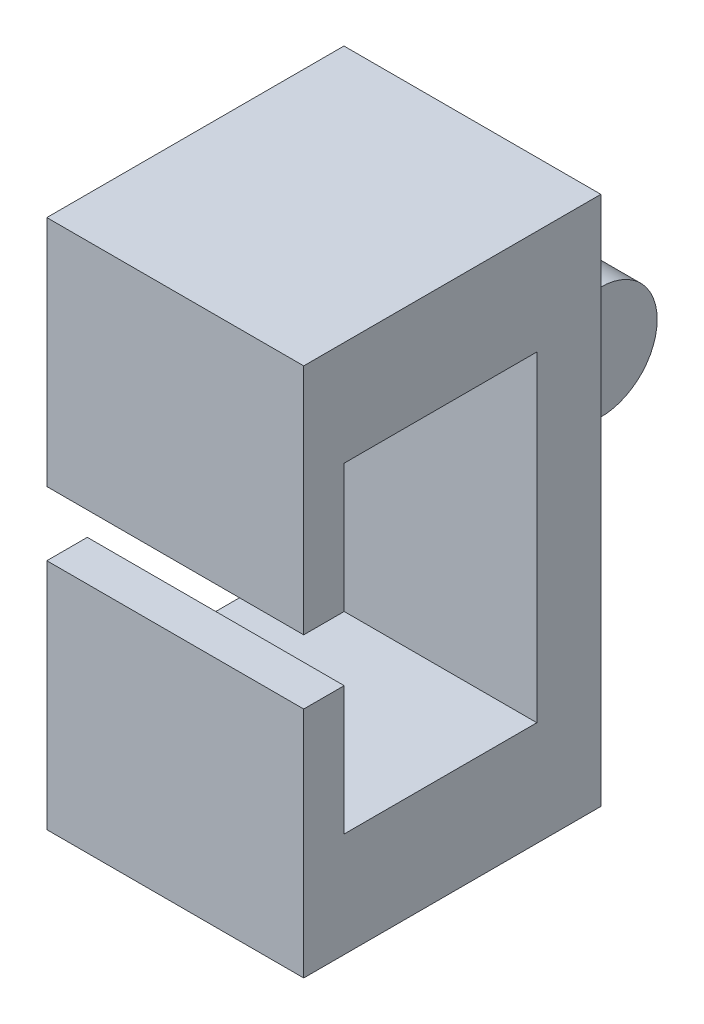
ISO-10303-21;
HEADER;
FILE_DESCRIPTION(('STEP AP214'),'2;1');
FILE_NAME('part.step','',(''),(''),'','','');
FILE_SCHEMA(('AUTOMOTIVE_DESIGN { 1 0 10303 214 1 1 1 1 }'));
ENDSEC;
DATA;
#1=APPLICATION_CONTEXT('core data for automotive mechanical design processes');
#2=APPLICATION_PROTOCOL_DEFINITION('international standard','automotive_design',2000,#1);
#3=PRODUCT_CONTEXT('',#1,'mechanical');
#4=PRODUCT('Part','Part','',(#3));
#5=PRODUCT_RELATED_PRODUCT_CATEGORY('part','',(#4));
#6=PRODUCT_DEFINITION_FORMATION('','',#4);
#7=PRODUCT_DEFINITION_CONTEXT('part definition',#1,'design');
#8=PRODUCT_DEFINITION('design','',#6,#7);
#9=PRODUCT_DEFINITION_SHAPE('','',#8);
#10=(LENGTH_UNIT() NAMED_UNIT(*) SI_UNIT(.MILLI.,.METRE.));
#11=(NAMED_UNIT(*) PLANE_ANGLE_UNIT() SI_UNIT($,.RADIAN.));
#12=(NAMED_UNIT(*) SI_UNIT($,.STERADIAN.) SOLID_ANGLE_UNIT());
#13=UNCERTAINTY_MEASURE_WITH_UNIT(LENGTH_MEASURE(1.E-05),#10,'distance_accuracy_value','');
#14=(GEOMETRIC_REPRESENTATION_CONTEXT(3) GLOBAL_UNCERTAINTY_ASSIGNED_CONTEXT((#13)) GLOBAL_UNIT_ASSIGNED_CONTEXT((#10,
#11,#12)) REPRESENTATION_CONTEXT('',''));
#15=CARTESIAN_POINT('',(0.,0.,0.));
#16=DIRECTION('',(0.,0.,1.));
#17=DIRECTION('',(1.,0.,0.));
#18=AXIS2_PLACEMENT_3D('',#15,#16,#17);
#19=CARTESIAN_POINT('',(25.4,0.,0.));
#20=DIRECTION('',(-1.,0.,0.));
#21=DIRECTION('',(0.,0.,1.));
#22=AXIS2_PLACEMENT_3D('',#19,#20,#21);
#23=CYLINDRICAL_SURFACE('',#22,11.1361216276526);
#24=CARTESIAN_POINT('',(25.4,0.,0.));
#25=DIRECTION('',(1.,0.,0.));
#26=DIRECTION('',(0.,0.,-1.));
#27=AXIS2_PLACEMENT_3D('',#24,#25,#26);
#28=CIRCLE('',#27,11.1361216276526);
#29=CARTESIAN_POINT('',(25.4,0.,-11.1361216276526));
#30=VERTEX_POINT('',#29);
#31=EDGE_CURVE('E52',#30,#30,#28,.T.);
#32=ORIENTED_EDGE('',*,*,#31,.F.);
#33=EDGE_LOOP('',(#32));
#34=FACE_BOUND('',#33,.T.);
#35=DIRECTION('',(-1.,0.,0.));
#36=VECTOR('',#35,1.);
#37=CARTESIAN_POINT('',(3.83463556575211,11.1361216276526,0.));
#38=LINE('',#37,#36);
#39=CARTESIAN_POINT('',(3.83463556575211,11.1361216276526,0.));
#40=VERTEX_POINT('',#39);
#41=CARTESIAN_POINT('',(0.,11.1361216276526,0.));
#42=VERTEX_POINT('',#41);
#43=EDGE_CURVE('E315',#40,#42,#38,.T.);
#44=ORIENTED_EDGE('',*,*,#43,.F.);
#45=CARTESIAN_POINT('',(3.83463556575211,0.,0.));
#46=DIRECTION('',(-1.,0.,0.));
#47=DIRECTION('',(0.,0.,1.));
#48=AXIS2_PLACEMENT_3D('',#45,#46,#47);
#49=CIRCLE('',#48,11.1361216276526);
#50=CARTESIAN_POINT('',(3.83463556575211,-11.1252,0.493082007248803));
#51=VERTEX_POINT('',#50);
#52=EDGE_CURVE('E11',#51,#40,#49,.T.);
#53=ORIENTED_EDGE('',*,*,#52,.F.);
#54=DIRECTION('',(-1.,0.,0.));
#55=VECTOR('',#54,1.);
#56=CARTESIAN_POINT('',(25.4,-11.1252,0.493082007248858));
#57=LINE('',#56,#55);
#58=CARTESIAN_POINT('',(0.,-11.1252,0.493082007248803));
#59=VERTEX_POINT('',#58);
#60=EDGE_CURVE('E65',#51,#59,#57,.T.);
#61=ORIENTED_EDGE('',*,*,#60,.T.);
#62=CARTESIAN_POINT('',(0.,0.,0.));
#63=DIRECTION('',(1.,0.,0.));
#64=DIRECTION('',(0.,0.,-1.));
#65=AXIS2_PLACEMENT_3D('',#62,#63,#64);
#66=CIRCLE('',#65,11.1361216276526);
#67=EDGE_CURVE('E323',#59,#42,#66,.T.);
#68=ORIENTED_EDGE('',*,*,#67,.T.);
#69=EDGE_LOOP('',(#44,#53,#61,#68));
#70=FACE_BOUND('',#69,.T.);
#71=ADVANCED_FACE('F44',(#34,#70),#23,.T.);
#72=CARTESIAN_POINT('',(25.4,0.,0.));
#73=DIRECTION('',(1.,0.,0.));
#74=DIRECTION('',(0.,0.,-1.));
#75=AXIS2_PLACEMENT_3D('',#72,#73,#74);
#76=PLANE('',#75);
#77=ORIENTED_EDGE('',*,*,#31,.T.);
#78=EDGE_LOOP('',(#77));
#79=FACE_BOUND('',#78,.T.);
#80=ADVANCED_FACE('F387',(#79),#76,.T.);
#81=CARTESIAN_POINT('',(0.,0.,0.));
#82=DIRECTION('',(1.,0.,0.));
#83=DIRECTION('',(0.,0.,-1.));
#84=AXIS2_PLACEMENT_3D('',#81,#82,#83);
#85=PLANE('',#84);
#86=ORIENTED_EDGE('',*,*,#67,.F.);
#87=DIRECTION('',(0.,0.,1.));
#88=VECTOR('',#87,1.);
#89=CARTESIAN_POINT('',(0.,-11.1252,0.));
#90=LINE('',#89,#88);
#91=CARTESIAN_POINT('',(0.,-11.1252,25.4));
#92=VERTEX_POINT('',#91);
#93=EDGE_CURVE('E294',#59,#92,#90,.T.);
#94=ORIENTED_EDGE('',*,*,#93,.T.);
#95=DIRECTION('',(0.,1.,0.));
#96=VECTOR('',#95,1.);
#97=CARTESIAN_POINT('',(0.,-31.75,25.4));
#98=LINE('',#97,#96);
#99=CARTESIAN_POINT('',(0.,-52.4146964792465,25.4));
#100=VERTEX_POINT('',#99);
#101=EDGE_CURVE('E285',#100,#92,#98,.T.);
#102=ORIENTED_EDGE('',*,*,#101,.F.);
#103=DIRECTION('',(0.,0.,-1.));
#104=VECTOR('',#103,1.);
#105=CARTESIAN_POINT('',(0.,-52.4146964792465,25.4));
#106=LINE('',#105,#104);
#107=CARTESIAN_POINT('',(0.,-52.4146964792465,84.1578930477657));
#108=VERTEX_POINT('',#107);
#109=EDGE_CURVE('E236',#108,#100,#106,.T.);
#110=ORIENTED_EDGE('',*,*,#109,.F.);
#111=DIRECTION('',(0.,-1.,0.));
#112=VECTOR('',#111,1.);
#113=CARTESIAN_POINT('',(0.,-52.4146964792465,84.1578930477657));
#114=LINE('',#113,#112);
#115=CARTESIAN_POINT('',(0.,-6.35,84.1578930477657));
#116=VERTEX_POINT('',#115);
#117=EDGE_CURVE('E168',#116,#108,#114,.T.);
#118=ORIENTED_EDGE('',*,*,#117,.F.);
#119=DIRECTION('',(0.,0.,1.));
#120=VECTOR('',#119,1.);
#121=CARTESIAN_POINT('',(0.,-6.35,76.1544905159104));
#122=LINE('',#121,#120);
#123=CARTESIAN_POINT('',(0.,-6.35,76.1544905159104));
#124=VERTEX_POINT('',#123);
#125=EDGE_CURVE('E192',#124,#116,#122,.T.);
#126=ORIENTED_EDGE('',*,*,#125,.F.);
#127=DIRECTION('',(0.,1.,0.));
#128=VECTOR('',#127,1.);
#129=CARTESIAN_POINT('',(0.,-52.4146964792465,76.1544905159105));
#130=LINE('',#129,#128);
#131=CARTESIAN_POINT('',(0.,-31.75,76.1544905159105));
#132=VERTEX_POINT('',#131);
#133=EDGE_CURVE('E175',#132,#124,#130,.T.);
#134=ORIENTED_EDGE('',*,*,#133,.F.);
#135=DIRECTION('',(0.,0.,1.));
#136=VECTOR('',#135,1.);
#137=CARTESIAN_POINT('',(0.,-31.75,25.4));
#138=LINE('',#137,#136);
#139=CARTESIAN_POINT('',(0.,-31.75,38.0544905159105));
#140=VERTEX_POINT('',#139);
#141=EDGE_CURVE('E241',#140,#132,#138,.T.);
#142=ORIENTED_EDGE('',*,*,#141,.F.);
#143=DIRECTION('',(0.,-1.,0.));
#144=VECTOR('',#143,1.);
#145=CARTESIAN_POINT('',(0.,-31.75,38.0544905159105));
#146=LINE('',#145,#144);
#147=CARTESIAN_POINT('',(0.,31.75,38.0544905159105));
#148=VERTEX_POINT('',#147);
#149=EDGE_CURVE('E279',#148,#140,#146,.T.);
#150=ORIENTED_EDGE('',*,*,#149,.F.);
#151=DIRECTION('',(0.,0.,-1.));
#152=VECTOR('',#151,1.);
#153=CARTESIAN_POINT('',(0.,31.75,25.4));
#154=LINE('',#153,#152);
#155=CARTESIAN_POINT('',(0.,31.75,76.1544905159105));
#156=VERTEX_POINT('',#155);
#157=EDGE_CURVE('E242',#156,#148,#154,.T.);
#158=ORIENTED_EDGE('',*,*,#157,.F.);
#159=DIRECTION('',(0.,1.,0.));
#160=VECTOR('',#159,1.);
#161=CARTESIAN_POINT('',(0.,52.4146964792465,76.1544905159105));
#162=LINE('',#161,#160);
#163=CARTESIAN_POINT('',(0.,6.35,76.1544905159105));
#164=VERTEX_POINT('',#163);
#165=EDGE_CURVE('E216',#164,#156,#162,.T.);
#166=ORIENTED_EDGE('',*,*,#165,.F.);
#167=DIRECTION('',(0.,0.,-1.));
#168=VECTOR('',#167,1.);
#169=CARTESIAN_POINT('',(0.,6.35,76.1544905159105));
#170=LINE('',#169,#168);
#171=CARTESIAN_POINT('',(0.,6.35,84.1578930477657));
#172=VERTEX_POINT('',#171);
#173=EDGE_CURVE('E218',#172,#164,#170,.T.);
#174=ORIENTED_EDGE('',*,*,#173,.F.);
#175=DIRECTION('',(0.,-1.,0.));
#176=VECTOR('',#175,1.);
#177=CARTESIAN_POINT('',(0.,52.4146964792465,84.1578930477657));
#178=LINE('',#177,#176);
#179=CARTESIAN_POINT('',(0.,52.4146964792465,84.1578930477657));
#180=VERTEX_POINT('',#179);
#181=EDGE_CURVE('E195',#180,#172,#178,.T.);
#182=ORIENTED_EDGE('',*,*,#181,.F.);
#183=DIRECTION('',(0.,0.,1.));
#184=VECTOR('',#183,1.);
#185=CARTESIAN_POINT('',(0.,52.4146964792465,25.4));
#186=LINE('',#185,#184);
#187=CARTESIAN_POINT('',(0.,52.4146964792465,25.4));
#188=VERTEX_POINT('',#187);
#189=EDGE_CURVE('E262',#188,#180,#186,.T.);
#190=ORIENTED_EDGE('',*,*,#189,.F.);
#191=CARTESIAN_POINT('',(0.,11.1361216276526,25.4));
#192=VERTEX_POINT('',#191);
#193=EDGE_CURVE('E251',#192,#188,#98,.T.);
#194=ORIENTED_EDGE('',*,*,#193,.F.);
#195=DIRECTION('',(0.,0.,1.));
#196=VECTOR('',#195,1.);
#197=CARTESIAN_POINT('',(0.,11.1361216276526,0.));
#198=LINE('',#197,#196);
#199=EDGE_CURVE('E297',#42,#192,#198,.T.);
#200=ORIENTED_EDGE('',*,*,#199,.F.);
#201=EDGE_LOOP('',(#86,#94,#102,#110,#118,#126,#134,#142,#150,#158,#166,#174,#182,#190,#194,#200));
#202=FACE_BOUND('',#201,.T.);
#203=ADVANCED_FACE('F340',(#202),#85,.F.);
#204=CARTESIAN_POINT('',(3.83463556575211,-11.1252,0.));
#205=DIRECTION('',(0.,-1.,0.));
#206=DIRECTION('',(0.,0.,-1.));
#207=AXIS2_PLACEMENT_3D('',#204,#205,#206);
#208=PLANE('',#207);
#209=ORIENTED_EDGE('',*,*,#60,.F.);
#210=DIRECTION('',(0.,0.,1.));
#211=VECTOR('',#210,1.);
#212=CARTESIAN_POINT('',(3.83463556575211,-11.1252,0.));
#213=LINE('',#212,#211);
#214=CARTESIAN_POINT('',(3.83463556575211,-11.1252,25.4));
#215=VERTEX_POINT('',#214);
#216=EDGE_CURVE('E298',#51,#215,#213,.T.);
#217=ORIENTED_EDGE('',*,*,#216,.T.);
#218=DIRECTION('',(-1.,0.,0.));
#219=VECTOR('',#218,1.);
#220=CARTESIAN_POINT('',(3.83463556575211,-11.1252,25.4));
#221=LINE('',#220,#219);
#222=EDGE_CURVE('E310',#215,#92,#221,.T.);
#223=ORIENTED_EDGE('',*,*,#222,.T.);
#224=ORIENTED_EDGE('',*,*,#93,.F.);
#225=EDGE_LOOP('',(#209,#217,#223,#224));
#226=FACE_BOUND('',#225,.T.);
#227=ADVANCED_FACE('F396',(#226),#208,.T.);
#228=CARTESIAN_POINT('',(3.83463556575211,11.1361216276526,0.));
#229=DIRECTION('',(0.,-1.,0.));
#230=DIRECTION('',(0.,0.,-1.));
#231=AXIS2_PLACEMENT_3D('',#228,#229,#230);
#232=PLANE('',#231);
#233=ORIENTED_EDGE('',*,*,#199,.T.);
#234=DIRECTION('',(-1.,0.,0.));
#235=VECTOR('',#234,1.);
#236=CARTESIAN_POINT('',(3.83463556575211,11.1361216276526,25.4));
#237=LINE('',#236,#235);
#238=CARTESIAN_POINT('',(3.83463556575211,11.1361216276526,25.4));
#239=VERTEX_POINT('',#238);
#240=EDGE_CURVE('E317',#239,#192,#237,.T.);
#241=ORIENTED_EDGE('',*,*,#240,.F.);
#242=DIRECTION('',(0.,0.,1.));
#243=VECTOR('',#242,1.);
#244=CARTESIAN_POINT('',(3.83463556575211,11.1361216276526,0.));
#245=LINE('',#244,#243);
#246=EDGE_CURVE('E302',#40,#239,#245,.T.);
#247=ORIENTED_EDGE('',*,*,#246,.F.);
#248=ORIENTED_EDGE('',*,*,#43,.T.);
#249=EDGE_LOOP('',(#233,#241,#247,#248));
#250=FACE_BOUND('',#249,.T.);
#251=ADVANCED_FACE('F334',(#250),#232,.F.);
#252=CARTESIAN_POINT('',(3.83463556575211,0.,0.));
#253=DIRECTION('',(-1.,0.,0.));
#254=DIRECTION('',(0.,0.,1.));
#255=AXIS2_PLACEMENT_3D('',#252,#253,#254);
#256=PLANE('',#255);
#257=ORIENTED_EDGE('',*,*,#216,.F.);
#258=ORIENTED_EDGE('',*,*,#52,.T.);
#259=ORIENTED_EDGE('',*,*,#246,.T.);
#260=DIRECTION('',(0.,-1.,0.));
#261=VECTOR('',#260,1.);
#262=CARTESIAN_POINT('',(3.83463556575211,11.1361216276526,25.4));
#263=LINE('',#262,#261);
#264=EDGE_CURVE('E299',#239,#215,#263,.T.);
#265=ORIENTED_EDGE('',*,*,#264,.T.);
#266=EDGE_LOOP('',(#257,#258,#259,#265));
#267=FACE_BOUND('',#266,.T.);
#268=ADVANCED_FACE('F404',(#267),#256,.F.);
#269=CARTESIAN_POINT('',(50.8,-31.75,25.4));
#270=DIRECTION('',(0.,0.,1.));
#271=DIRECTION('',(1.,0.,0.));
#272=AXIS2_PLACEMENT_3D('',#269,#270,#271);
#273=PLANE('',#272);
#274=ORIENTED_EDGE('',*,*,#222,.F.);
#275=ORIENTED_EDGE('',*,*,#264,.F.);
#276=ORIENTED_EDGE('',*,*,#240,.T.);
#277=ORIENTED_EDGE('',*,*,#193,.T.);
#278=DIRECTION('',(-1.,0.,0.));
#279=VECTOR('',#278,1.);
#280=CARTESIAN_POINT('',(50.8,52.4146964792465,25.4));
#281=LINE('',#280,#279);
#282=CARTESIAN_POINT('',(50.8,52.4146964792465,25.4));
#283=VERTEX_POINT('',#282);
#284=EDGE_CURVE('E176',#283,#188,#281,.T.);
#285=ORIENTED_EDGE('',*,*,#284,.F.);
#286=DIRECTION('',(0.,1.,0.));
#287=VECTOR('',#286,1.);
#288=CARTESIAN_POINT('',(50.8,-31.75,25.4));
#289=LINE('',#288,#287);
#290=CARTESIAN_POINT('',(50.8,-52.4146964792465,25.4));
#291=VERTEX_POINT('',#290);
#292=EDGE_CURVE('E274',#291,#283,#289,.T.);
#293=ORIENTED_EDGE('',*,*,#292,.F.);
#294=DIRECTION('',(-1.,0.,0.));
#295=VECTOR('',#294,1.);
#296=CARTESIAN_POINT('',(50.8,-52.4146964792465,25.4));
#297=LINE('',#296,#295);
#298=EDGE_CURVE('E239',#291,#100,#297,.T.);
#299=ORIENTED_EDGE('',*,*,#298,.T.);
#300=ORIENTED_EDGE('',*,*,#101,.T.);
#301=EDGE_LOOP('',(#274,#275,#276,#277,#285,#293,#299,#300));
#302=FACE_BOUND('',#301,.T.);
#303=ADVANCED_FACE('F341',(#302),#273,.F.);
#304=CARTESIAN_POINT('',(50.8,-31.75,38.0544905159105));
#305=DIRECTION('',(0.,0.,-1.));
#306=DIRECTION('',(-1.,0.,0.));
#307=AXIS2_PLACEMENT_3D('',#304,#305,#306);
#308=PLANE('',#307);
#309=ORIENTED_EDGE('',*,*,#149,.T.);
#310=DIRECTION('',(-1.,0.,0.));
#311=VECTOR('',#310,1.);
#312=CARTESIAN_POINT('',(50.8,-31.75,38.0544905159105));
#313=LINE('',#312,#311);
#314=CARTESIAN_POINT('',(50.8,-31.75,38.0544905159105));
#315=VERTEX_POINT('',#314);
#316=EDGE_CURVE('E281',#315,#140,#313,.T.);
#317=ORIENTED_EDGE('',*,*,#316,.F.);
#318=DIRECTION('',(0.,-1.,0.));
#319=VECTOR('',#318,1.);
#320=CARTESIAN_POINT('',(50.8,-31.75,38.0544905159105));
#321=LINE('',#320,#319);
#322=CARTESIAN_POINT('',(50.8,31.75,38.0544905159105));
#323=VERTEX_POINT('',#322);
#324=EDGE_CURVE('E280',#323,#315,#321,.T.);
#325=ORIENTED_EDGE('',*,*,#324,.F.);
#326=DIRECTION('',(-1.,0.,0.));
#327=VECTOR('',#326,1.);
#328=CARTESIAN_POINT('',(50.8,31.75,38.0544905159105));
#329=LINE('',#328,#327);
#330=EDGE_CURVE('E293',#323,#148,#329,.T.);
#331=ORIENTED_EDGE('',*,*,#330,.T.);
#332=EDGE_LOOP('',(#309,#317,#325,#331));
#333=FACE_BOUND('',#332,.T.);
#334=ADVANCED_FACE('F368',(#333),#308,.F.);
#335=CARTESIAN_POINT('',(50.8,0.,0.));
#336=DIRECTION('',(-1.,0.,0.));
#337=DIRECTION('',(0.,0.,1.));
#338=AXIS2_PLACEMENT_3D('',#335,#336,#337);
#339=PLANE('',#338);
#340=ORIENTED_EDGE('',*,*,#324,.T.);
#341=DIRECTION('',(0.,0.,1.));
#342=VECTOR('',#341,1.);
#343=CARTESIAN_POINT('',(50.8,-31.75,25.4));
#344=LINE('',#343,#342);
#345=CARTESIAN_POINT('',(50.8,-31.75,76.1544905159105));
#346=VERTEX_POINT('',#345);
#347=EDGE_CURVE('E163',#315,#346,#344,.T.);
#348=ORIENTED_EDGE('',*,*,#347,.T.);
#349=DIRECTION('',(0.,1.,0.));
#350=VECTOR('',#349,1.);
#351=CARTESIAN_POINT('',(50.8,-52.4146964792465,76.1544905159105));
#352=LINE('',#351,#350);
#353=CARTESIAN_POINT('',(50.8,-6.35,76.1544905159104));
#354=VERTEX_POINT('',#353);
#355=EDGE_CURVE('E152',#346,#354,#352,.T.);
#356=ORIENTED_EDGE('',*,*,#355,.T.);
#357=DIRECTION('',(0.,0.,1.));
#358=VECTOR('',#357,1.);
#359=CARTESIAN_POINT('',(50.8,-6.35,76.1544905159104));
#360=LINE('',#359,#358);
#361=CARTESIAN_POINT('',(50.8,-6.35,84.1578930477657));
#362=VERTEX_POINT('',#361);
#363=EDGE_CURVE('E156',#354,#362,#360,.T.);
#364=ORIENTED_EDGE('',*,*,#363,.T.);
#365=DIRECTION('',(0.,-1.,0.));
#366=VECTOR('',#365,1.);
#367=CARTESIAN_POINT('',(50.8,-52.4146964792465,84.1578930477657));
#368=LINE('',#367,#366);
#369=CARTESIAN_POINT('',(50.8,-52.4146964792465,84.1578930477657));
#370=VERTEX_POINT('',#369);
#371=EDGE_CURVE('E182',#362,#370,#368,.T.);
#372=ORIENTED_EDGE('',*,*,#371,.T.);
#373=DIRECTION('',(0.,0.,-1.));
#374=VECTOR('',#373,1.);
#375=CARTESIAN_POINT('',(50.8,-52.4146964792465,25.4));
#376=LINE('',#375,#374);
#377=EDGE_CURVE('E232',#370,#291,#376,.T.);
#378=ORIENTED_EDGE('',*,*,#377,.T.);
#379=ORIENTED_EDGE('',*,*,#292,.T.);
#380=DIRECTION('',(0.,0.,1.));
#381=VECTOR('',#380,1.);
#382=CARTESIAN_POINT('',(50.8,52.4146964792465,25.4));
#383=LINE('',#382,#381);
#384=CARTESIAN_POINT('',(50.8,52.4146964792465,84.1578930477657));
#385=VERTEX_POINT('',#384);
#386=EDGE_CURVE('E265',#283,#385,#383,.T.);
#387=ORIENTED_EDGE('',*,*,#386,.T.);
#388=DIRECTION('',(0.,-1.,0.));
#389=VECTOR('',#388,1.);
#390=CARTESIAN_POINT('',(50.8,52.4146964792465,84.1578930477657));
#391=LINE('',#390,#389);
#392=CARTESIAN_POINT('',(50.8,6.35,84.1578930477657));
#393=VERTEX_POINT('',#392);
#394=EDGE_CURVE('E219',#385,#393,#391,.T.);
#395=ORIENTED_EDGE('',*,*,#394,.T.);
#396=DIRECTION('',(0.,0.,-1.));
#397=VECTOR('',#396,1.);
#398=CARTESIAN_POINT('',(50.8,6.35,76.1544905159105));
#399=LINE('',#398,#397);
#400=CARTESIAN_POINT('',(50.8,6.35,76.1544905159105));
#401=VERTEX_POINT('',#400);
#402=EDGE_CURVE('E226',#393,#401,#399,.T.);
#403=ORIENTED_EDGE('',*,*,#402,.T.);
#404=DIRECTION('',(0.,1.,0.));
#405=VECTOR('',#404,1.);
#406=CARTESIAN_POINT('',(50.8,52.4146964792465,76.1544905159105));
#407=LINE('',#406,#405);
#408=CARTESIAN_POINT('',(50.8,31.75,76.1544905159105));
#409=VERTEX_POINT('',#408);
#410=EDGE_CURVE('E213',#401,#409,#407,.T.);
#411=ORIENTED_EDGE('',*,*,#410,.T.);
#412=DIRECTION('',(0.,0.,-1.));
#413=VECTOR('',#412,1.);
#414=CARTESIAN_POINT('',(50.8,31.75,25.4));
#415=LINE('',#414,#413);
#416=EDGE_CURVE('E268',#409,#323,#415,.T.);
#417=ORIENTED_EDGE('',*,*,#416,.T.);
#418=EDGE_LOOP('',(#340,#348,#356,#364,#372,#378,#379,#387,#395,#403,#411,#417));
#419=FACE_BOUND('',#418,.T.);
#420=ADVANCED_FACE('F154',(#419),#339,.F.);
#421=CARTESIAN_POINT('',(50.8,31.75,25.4));
#422=DIRECTION('',(0.,1.,0.));
#423=DIRECTION('',(0.,0.,1.));
#424=AXIS2_PLACEMENT_3D('',#421,#422,#423);
#425=PLANE('',#424);
#426=ORIENTED_EDGE('',*,*,#330,.F.);
#427=ORIENTED_EDGE('',*,*,#416,.F.);
#428=DIRECTION('',(-1.,0.,0.));
#429=VECTOR('',#428,1.);
#430=CARTESIAN_POINT('',(50.8,31.75,76.1544905159105));
#431=LINE('',#430,#429);
#432=EDGE_CURVE('E259',#409,#156,#431,.T.);
#433=ORIENTED_EDGE('',*,*,#432,.T.);
#434=ORIENTED_EDGE('',*,*,#157,.T.);
#435=EDGE_LOOP('',(#426,#427,#433,#434));
#436=FACE_BOUND('',#435,.T.);
#437=ADVANCED_FACE('F364',(#436),#425,.F.);
#438=CARTESIAN_POINT('',(50.8,52.4146964792465,25.4));
#439=DIRECTION('',(0.,-1.,0.));
#440=DIRECTION('',(0.,0.,-1.));
#441=AXIS2_PLACEMENT_3D('',#438,#439,#440);
#442=PLANE('',#441);
#443=ORIENTED_EDGE('',*,*,#189,.T.);
#444=DIRECTION('',(-1.,0.,0.));
#445=VECTOR('',#444,1.);
#446=CARTESIAN_POINT('',(50.8,52.4146964792465,84.1578930477657));
#447=LINE('',#446,#445);
#448=EDGE_CURVE('E201',#385,#180,#447,.T.);
#449=ORIENTED_EDGE('',*,*,#448,.F.);
#450=ORIENTED_EDGE('',*,*,#386,.F.);
#451=ORIENTED_EDGE('',*,*,#284,.T.);
#452=EDGE_LOOP('',(#443,#449,#450,#451));
#453=FACE_BOUND('',#452,.T.);
#454=ADVANCED_FACE('F347',(#453),#442,.F.);
#455=CARTESIAN_POINT('',(50.8,-31.75,25.4));
#456=DIRECTION('',(0.,-1.,0.));
#457=DIRECTION('',(0.,0.,-1.));
#458=AXIS2_PLACEMENT_3D('',#455,#456,#457);
#459=PLANE('',#458);
#460=ORIENTED_EDGE('',*,*,#347,.F.);
#461=ORIENTED_EDGE('',*,*,#316,.T.);
#462=ORIENTED_EDGE('',*,*,#141,.T.);
#463=DIRECTION('',(-1.,0.,0.));
#464=VECTOR('',#463,1.);
#465=CARTESIAN_POINT('',(50.8,-31.75,76.1544905159105));
#466=LINE('',#465,#464);
#467=EDGE_CURVE('E252',#346,#132,#466,.T.);
#468=ORIENTED_EDGE('',*,*,#467,.F.);
#469=EDGE_LOOP('',(#460,#461,#462,#468));
#470=FACE_BOUND('',#469,.T.);
#471=ADVANCED_FACE('F373',(#470),#459,.F.);
#472=CARTESIAN_POINT('',(50.8,-52.4146964792465,25.4));
#473=DIRECTION('',(0.,1.,0.));
#474=DIRECTION('',(0.,0.,1.));
#475=AXIS2_PLACEMENT_3D('',#472,#473,#474);
#476=PLANE('',#475);
#477=ORIENTED_EDGE('',*,*,#109,.T.);
#478=ORIENTED_EDGE('',*,*,#298,.F.);
#479=ORIENTED_EDGE('',*,*,#377,.F.);
#480=DIRECTION('',(-1.,0.,0.));
#481=VECTOR('',#480,1.);
#482=CARTESIAN_POINT('',(50.8,-52.4146964792465,84.1578930477657));
#483=LINE('',#482,#481);
#484=EDGE_CURVE('E187',#370,#108,#483,.T.);
#485=ORIENTED_EDGE('',*,*,#484,.T.);
#486=EDGE_LOOP('',(#477,#478,#479,#485));
#487=FACE_BOUND('',#486,.T.);
#488=ADVANCED_FACE('F374',(#487),#476,.F.);
#489=CARTESIAN_POINT('',(50.8,-52.4146964792465,76.1544905159105));
#490=DIRECTION('',(0.,0.,1.));
#491=DIRECTION('',(0.,-1.,0.));
#492=AXIS2_PLACEMENT_3D('',#489,#490,#491);
#493=PLANE('',#492);
#494=ORIENTED_EDGE('',*,*,#355,.F.);
#495=ORIENTED_EDGE('',*,*,#467,.T.);
#496=ORIENTED_EDGE('',*,*,#133,.T.);
#497=DIRECTION('',(-1.,0.,0.));
#498=VECTOR('',#497,1.);
#499=CARTESIAN_POINT('',(50.8,-6.35,76.1544905159104));
#500=LINE('',#499,#498);
#501=EDGE_CURVE('E169',#354,#124,#500,.T.);
#502=ORIENTED_EDGE('',*,*,#501,.F.);
#503=EDGE_LOOP('',(#494,#495,#496,#502));
#504=FACE_BOUND('',#503,.T.);
#505=ADVANCED_FACE('F167',(#504),#493,.F.);
#506=CARTESIAN_POINT('',(50.8,-6.35,76.1544905159104));
#507=DIRECTION('',(0.,-1.,0.));
#508=DIRECTION('',(0.,0.,-1.));
#509=AXIS2_PLACEMENT_3D('',#506,#507,#508);
#510=PLANE('',#509);
#511=ORIENTED_EDGE('',*,*,#125,.T.);
#512=DIRECTION('',(-1.,0.,0.));
#513=VECTOR('',#512,1.);
#514=CARTESIAN_POINT('',(50.8,-6.35,84.1578930477657));
#515=LINE('',#514,#513);
#516=EDGE_CURVE('E180',#362,#116,#515,.T.);
#517=ORIENTED_EDGE('',*,*,#516,.F.);
#518=ORIENTED_EDGE('',*,*,#363,.F.);
#519=ORIENTED_EDGE('',*,*,#501,.T.);
#520=EDGE_LOOP('',(#511,#517,#518,#519));
#521=FACE_BOUND('',#520,.T.);
#522=ADVANCED_FACE('F177',(#521),#510,.F.);
#523=CARTESIAN_POINT('',(50.8,-52.4146964792465,84.1578930477657));
#524=DIRECTION('',(0.,0.,-1.));
#525=DIRECTION('',(-1.,0.,0.));
#526=AXIS2_PLACEMENT_3D('',#523,#524,#525);
#527=PLANE('',#526);
#528=ORIENTED_EDGE('',*,*,#117,.T.);
#529=ORIENTED_EDGE('',*,*,#484,.F.);
#530=ORIENTED_EDGE('',*,*,#371,.F.);
#531=ORIENTED_EDGE('',*,*,#516,.T.);
#532=EDGE_LOOP('',(#528,#529,#530,#531));
#533=FACE_BOUND('',#532,.T.);
#534=ADVANCED_FACE('F456',(#533),#527,.F.);
#535=CARTESIAN_POINT('',(50.8,52.4146964792465,84.1578930477657));
#536=DIRECTION('',(0.,0.,-1.));
#537=DIRECTION('',(0.,1.,0.));
#538=AXIS2_PLACEMENT_3D('',#535,#536,#537);
#539=PLANE('',#538);
#540=ORIENTED_EDGE('',*,*,#181,.T.);
#541=DIRECTION('',(-1.,0.,0.));
#542=VECTOR('',#541,1.);
#543=CARTESIAN_POINT('',(50.8,6.35,84.1578930477657));
#544=LINE('',#543,#542);
#545=EDGE_CURVE('E210',#393,#172,#544,.T.);
#546=ORIENTED_EDGE('',*,*,#545,.F.);
#547=ORIENTED_EDGE('',*,*,#394,.F.);
#548=ORIENTED_EDGE('',*,*,#448,.T.);
#549=EDGE_LOOP('',(#540,#546,#547,#548));
#550=FACE_BOUND('',#549,.T.);
#551=ADVANCED_FACE('F351',(#550),#539,.F.);
#552=CARTESIAN_POINT('',(50.8,6.35,76.1544905159105));
#553=DIRECTION('',(0.,1.,0.));
#554=DIRECTION('',(0.,0.,1.));
#555=AXIS2_PLACEMENT_3D('',#552,#553,#554);
#556=PLANE('',#555);
#557=ORIENTED_EDGE('',*,*,#173,.T.);
#558=DIRECTION('',(-1.,0.,0.));
#559=VECTOR('',#558,1.);
#560=CARTESIAN_POINT('',(50.8,6.35,76.1544905159105));
#561=LINE('',#560,#559);
#562=EDGE_CURVE('E212',#401,#164,#561,.T.);
#563=ORIENTED_EDGE('',*,*,#562,.F.);
#564=ORIENTED_EDGE('',*,*,#402,.F.);
#565=ORIENTED_EDGE('',*,*,#545,.T.);
#566=EDGE_LOOP('',(#557,#563,#564,#565));
#567=FACE_BOUND('',#566,.T.);
#568=ADVANCED_FACE('F356',(#567),#556,.F.);
#569=CARTESIAN_POINT('',(50.8,52.4146964792465,76.1544905159105));
#570=DIRECTION('',(0.,0.,1.));
#571=DIRECTION('',(1.,0.,0.));
#572=AXIS2_PLACEMENT_3D('',#569,#570,#571);
#573=PLANE('',#572);
#574=ORIENTED_EDGE('',*,*,#432,.F.);
#575=ORIENTED_EDGE('',*,*,#410,.F.);
#576=ORIENTED_EDGE('',*,*,#562,.T.);
#577=ORIENTED_EDGE('',*,*,#165,.T.);
#578=EDGE_LOOP('',(#574,#575,#576,#577));
#579=FACE_BOUND('',#578,.T.);
#580=ADVANCED_FACE('F485',(#579),#573,.F.);
#581=CLOSED_SHELL('',(#71,#80,#203,#227,#251,#268,#303,#334,#420,#437,#454,#471,#488,#505,#522,
#534,#551,#568,#580));
#582=MANIFOLD_SOLID_BREP('B2',#581);
#583=ADVANCED_BREP_SHAPE_REPRESENTATION('',(#18,#582),#14);
#584=SHAPE_DEFINITION_REPRESENTATION(#9,#583);
ENDSEC;
END-ISO-10303-21;
